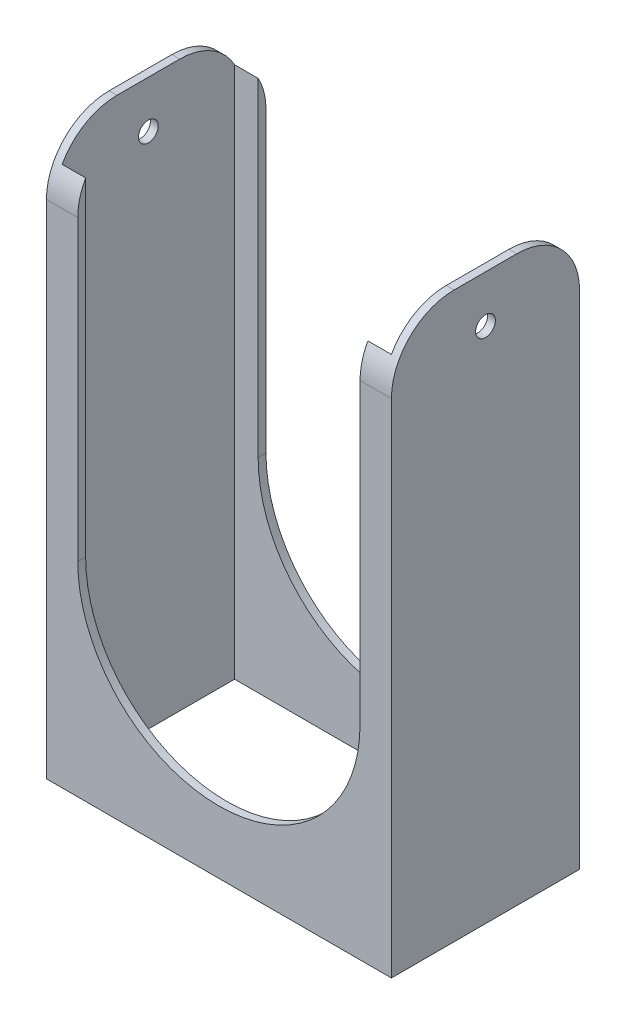
ISO-10303-21;
HEADER;
FILE_DESCRIPTION(('STEP AP214'),'2;1');
FILE_NAME('part.step','',(''),(''),'','','');
FILE_SCHEMA(('AUTOMOTIVE_DESIGN { 1 0 10303 214 1 1 1 1 }'));
ENDSEC;
DATA;
#1=APPLICATION_CONTEXT('core data for automotive mechanical design processes');
#2=APPLICATION_PROTOCOL_DEFINITION('international standard','automotive_design',2000,#1);
#3=PRODUCT_CONTEXT('',#1,'mechanical');
#4=PRODUCT('Part','Part','',(#3));
#5=PRODUCT_RELATED_PRODUCT_CATEGORY('part','',(#4));
#6=PRODUCT_DEFINITION_FORMATION('','',#4);
#7=PRODUCT_DEFINITION_CONTEXT('part definition',#1,'design');
#8=PRODUCT_DEFINITION('design','',#6,#7);
#9=PRODUCT_DEFINITION_SHAPE('','',#8);
#10=(LENGTH_UNIT() NAMED_UNIT(*) SI_UNIT(.MILLI.,.METRE.));
#11=(NAMED_UNIT(*) PLANE_ANGLE_UNIT() SI_UNIT($,.RADIAN.));
#12=(NAMED_UNIT(*) SI_UNIT($,.STERADIAN.) SOLID_ANGLE_UNIT());
#13=UNCERTAINTY_MEASURE_WITH_UNIT(LENGTH_MEASURE(1.E-05),#10,'distance_accuracy_value','');
#14=(GEOMETRIC_REPRESENTATION_CONTEXT(3) GLOBAL_UNCERTAINTY_ASSIGNED_CONTEXT((#13)) GLOBAL_UNIT_ASSIGNED_CONTEXT((#10,
#11,#12)) REPRESENTATION_CONTEXT('',''));
#15=CARTESIAN_POINT('',(0.,0.,0.));
#16=DIRECTION('',(0.,0.,1.));
#17=DIRECTION('',(1.,0.,0.));
#18=AXIS2_PLACEMENT_3D('',#15,#16,#17);
#19=CARTESIAN_POINT('',(-69.85,203.2,12.7));
#20=DIRECTION('',(1.,0.,0.));
#21=DIRECTION('',(0.,0.,-1.));
#22=AXIS2_PLACEMENT_3D('',#19,#20,#21);
#23=CYLINDRICAL_SURFACE('',#22,25.4);
#24=DIRECTION('',(1.,0.,0.));
#25=VECTOR('',#24,1.);
#26=CARTESIAN_POINT('',(-69.85,203.2,38.1));
#27=LINE('',#26,#25);
#28=CARTESIAN_POINT('',(-69.85,203.2,38.1));
#29=VERTEX_POINT('',#28);
#30=CARTESIAN_POINT('',(-57.15,203.2,38.1));
#31=VERTEX_POINT('',#30);
#32=EDGE_CURVE('E362',#29,#31,#27,.T.);
#33=ORIENTED_EDGE('',*,*,#32,.T.);
#34=CARTESIAN_POINT('',(-57.15,203.2,12.7));
#35=DIRECTION('',(-1.,0.,0.));
#36=DIRECTION('',(0.,0.,1.));
#37=AXIS2_PLACEMENT_3D('',#34,#35,#36);
#38=CIRCLE('',#37,25.4);
#39=CARTESIAN_POINT('',(-57.15,215.496722124209,34.925));
#40=VERTEX_POINT('',#39);
#41=EDGE_CURVE('E236',#31,#40,#38,.T.);
#42=ORIENTED_EDGE('',*,*,#41,.T.);
#43=DIRECTION('',(1.,0.,0.));
#44=VECTOR('',#43,1.);
#45=CARTESIAN_POINT('',(-69.85,215.496722124209,34.925));
#46=LINE('',#45,#44);
#47=CARTESIAN_POINT('',(-66.675,215.496722124209,34.925));
#48=VERTEX_POINT('',#47);
#49=EDGE_CURVE('E231',#40,#48,#46,.F.);
#50=ORIENTED_EDGE('',*,*,#49,.T.);
#51=CARTESIAN_POINT('',(-66.675,203.2,12.7));
#52=DIRECTION('',(1.,0.,0.));
#53=DIRECTION('',(0.,0.,-1.));
#54=AXIS2_PLACEMENT_3D('',#51,#52,#53);
#55=CIRCLE('',#54,25.4);
#56=CARTESIAN_POINT('',(-66.675,228.6,12.7));
#57=VERTEX_POINT('',#56);
#58=EDGE_CURVE('E234',#48,#57,#55,.F.);
#59=ORIENTED_EDGE('',*,*,#58,.T.);
#60=DIRECTION('',(1.,0.,0.));
#61=VECTOR('',#60,1.);
#62=CARTESIAN_POINT('',(-69.85,228.6,12.7));
#63=LINE('',#62,#61);
#64=CARTESIAN_POINT('',(-69.85,228.6,12.7));
#65=VERTEX_POINT('',#64);
#66=EDGE_CURVE('E428',#65,#57,#63,.T.);
#67=ORIENTED_EDGE('',*,*,#66,.F.);
#68=CARTESIAN_POINT('',(-69.85,203.2,12.7));
#69=DIRECTION('',(-1.,0.,0.));
#70=DIRECTION('',(0.,0.,1.));
#71=AXIS2_PLACEMENT_3D('',#68,#69,#70);
#72=CIRCLE('',#71,25.4);
#73=EDGE_CURVE('E417',#29,#65,#72,.T.);
#74=ORIENTED_EDGE('',*,*,#73,.F.);
#75=EDGE_LOOP('',(#33,#42,#50,#59,#67,#74));
#76=FACE_BOUND('',#75,.T.);
#77=ADVANCED_FACE('F44',(#76),#23,.T.);
#78=CARTESIAN_POINT('',(-69.85,203.2,-12.7));
#79=DIRECTION('',(1.,0.,0.));
#80=DIRECTION('',(0.,0.,-1.));
#81=AXIS2_PLACEMENT_3D('',#78,#79,#80);
#82=CYLINDRICAL_SURFACE('',#81,25.4);
#83=DIRECTION('',(1.,0.,0.));
#84=VECTOR('',#83,1.);
#85=CARTESIAN_POINT('',(-69.85,215.496722124209,-34.925));
#86=LINE('',#85,#84);
#87=CARTESIAN_POINT('',(-66.675,215.496722124209,-34.925));
#88=VERTEX_POINT('',#87);
#89=CARTESIAN_POINT('',(-57.15,215.496722124209,-34.925));
#90=VERTEX_POINT('',#89);
#91=EDGE_CURVE('E335',#88,#90,#86,.T.);
#92=ORIENTED_EDGE('',*,*,#91,.T.);
#93=CARTESIAN_POINT('',(-57.15,203.2,-12.7));
#94=DIRECTION('',(-1.,0.,0.));
#95=DIRECTION('',(0.,0.,1.));
#96=AXIS2_PLACEMENT_3D('',#93,#94,#95);
#97=CIRCLE('',#96,25.4);
#98=CARTESIAN_POINT('',(-57.15,203.2,-38.1));
#99=VERTEX_POINT('',#98);
#100=EDGE_CURVE('E55',#90,#99,#97,.T.);
#101=ORIENTED_EDGE('',*,*,#100,.T.);
#102=DIRECTION('',(1.,0.,0.));
#103=VECTOR('',#102,1.);
#104=CARTESIAN_POINT('',(-69.85,203.2,-38.1));
#105=LINE('',#104,#103);
#106=CARTESIAN_POINT('',(-69.85,203.2,-38.1));
#107=VERTEX_POINT('',#106);
#108=EDGE_CURVE('E332',#107,#99,#105,.T.);
#109=ORIENTED_EDGE('',*,*,#108,.F.);
#110=CARTESIAN_POINT('',(-69.85,203.2,-12.7));
#111=DIRECTION('',(-1.,0.,0.));
#112=DIRECTION('',(0.,0.,1.));
#113=AXIS2_PLACEMENT_3D('',#110,#111,#112);
#114=CIRCLE('',#113,25.4);
#115=CARTESIAN_POINT('',(-69.85,228.6,-12.7));
#116=VERTEX_POINT('',#115);
#117=EDGE_CURVE('E352',#116,#107,#114,.T.);
#118=ORIENTED_EDGE('',*,*,#117,.F.);
#119=DIRECTION('',(1.,0.,0.));
#120=VECTOR('',#119,1.);
#121=CARTESIAN_POINT('',(-69.85,228.6,-12.7));
#122=LINE('',#121,#120);
#123=CARTESIAN_POINT('',(-66.675,228.6,-12.7));
#124=VERTEX_POINT('',#123);
#125=EDGE_CURVE('E350',#116,#124,#122,.T.);
#126=ORIENTED_EDGE('',*,*,#125,.T.);
#127=CARTESIAN_POINT('',(-66.675,203.2,-12.7));
#128=DIRECTION('',(1.,0.,0.));
#129=DIRECTION('',(0.,0.,-1.));
#130=AXIS2_PLACEMENT_3D('',#127,#128,#129);
#131=CIRCLE('',#130,25.4);
#132=EDGE_CURVE('E255',#124,#88,#131,.F.);
#133=ORIENTED_EDGE('',*,*,#132,.T.);
#134=EDGE_LOOP('',(#92,#101,#109,#118,#126,#133));
#135=FACE_BOUND('',#134,.T.);
#136=ADVANCED_FACE('F331',(#135),#82,.T.);
#137=CARTESIAN_POINT('',(0.,228.6,0.));
#138=DIRECTION('',(0.,-1.,0.));
#139=DIRECTION('',(0.,0.,-1.));
#140=AXIS2_PLACEMENT_3D('',#137,#138,#139);
#141=PLANE('',#140);
#142=DIRECTION('',(0.,0.,-1.));
#143=VECTOR('',#142,1.);
#144=CARTESIAN_POINT('',(69.85,228.6,38.1));
#145=LINE('',#144,#143);
#146=CARTESIAN_POINT('',(69.85,228.6,12.7));
#147=VERTEX_POINT('',#146);
#148=CARTESIAN_POINT('',(69.85,228.6,-12.7));
#149=VERTEX_POINT('',#148);
#150=EDGE_CURVE('E281',#147,#149,#145,.T.);
#151=ORIENTED_EDGE('',*,*,#150,.T.);
#152=CARTESIAN_POINT('',(66.675,228.6,-12.7));
#153=VERTEX_POINT('',#152);
#154=EDGE_CURVE('E345',#153,#149,#122,.T.);
#155=ORIENTED_EDGE('',*,*,#154,.F.);
#156=DIRECTION('',(0.,0.,-1.));
#157=VECTOR('',#156,1.);
#158=CARTESIAN_POINT('',(66.675,228.6,34.925));
#159=LINE('',#158,#157);
#160=CARTESIAN_POINT('',(66.675,228.6,12.7));
#161=VERTEX_POINT('',#160);
#162=EDGE_CURVE('E269',#161,#153,#159,.T.);
#163=ORIENTED_EDGE('',*,*,#162,.F.);
#164=EDGE_CURVE('E421',#161,#147,#63,.T.);
#165=ORIENTED_EDGE('',*,*,#164,.T.);
#166=EDGE_LOOP('',(#151,#155,#163,#165));
#167=FACE_BOUND('',#166,.T.);
#168=ADVANCED_FACE('F474',(#167),#141,.F.);
#169=DIRECTION('',(0.,0.,1.));
#170=VECTOR('',#169,1.);
#171=CARTESIAN_POINT('',(-66.675,228.6,34.925));
#172=LINE('',#171,#170);
#173=EDGE_CURVE('E253',#124,#57,#172,.T.);
#174=ORIENTED_EDGE('',*,*,#173,.F.);
#175=ORIENTED_EDGE('',*,*,#125,.F.);
#176=DIRECTION('',(0.,0.,1.));
#177=VECTOR('',#176,1.);
#178=CARTESIAN_POINT('',(-69.85,228.6,38.1));
#179=LINE('',#178,#177);
#180=EDGE_CURVE('E285',#116,#65,#179,.T.);
#181=ORIENTED_EDGE('',*,*,#180,.T.);
#182=ORIENTED_EDGE('',*,*,#66,.T.);
#183=EDGE_LOOP('',(#174,#175,#181,#182));
#184=FACE_BOUND('',#183,.T.);
#185=ADVANCED_FACE('F458',(#184),#141,.F.);
#186=CARTESIAN_POINT('',(-69.85,228.6,-38.1));
#187=DIRECTION('',(0.,0.,1.));
#188=DIRECTION('',(1.,0.,0.));
#189=AXIS2_PLACEMENT_3D('',#186,#187,#188);
#190=PLANE('',#189);
#191=ORIENTED_EDGE('',*,*,#108,.T.);
#192=DIRECTION('',(0.,-1.,0.));
#193=VECTOR('',#192,1.);
#194=CARTESIAN_POINT('',(-57.15,82.55,-38.1));
#195=LINE('',#194,#193);
#196=CARTESIAN_POINT('',(-57.15,82.55,-38.1));
#197=VERTEX_POINT('',#196);
#198=EDGE_CURVE('E343',#99,#197,#195,.T.);
#199=ORIENTED_EDGE('',*,*,#198,.T.);
#200=CARTESIAN_POINT('',(0.,82.55,-38.1));
#201=DIRECTION('',(0.,0.,1.));
#202=DIRECTION('',(1.,0.,0.));
#203=AXIS2_PLACEMENT_3D('',#200,#201,#202);
#204=CIRCLE('',#203,57.15);
#205=CARTESIAN_POINT('',(57.15,82.55,-38.1));
#206=VERTEX_POINT('',#205);
#207=EDGE_CURVE('E509',#197,#206,#204,.T.);
#208=ORIENTED_EDGE('',*,*,#207,.T.);
#209=DIRECTION('',(0.,1.,0.));
#210=VECTOR('',#209,1.);
#211=CARTESIAN_POINT('',(57.15,228.6,-38.1));
#212=LINE('',#211,#210);
#213=CARTESIAN_POINT('',(57.15,203.2,-38.1));
#214=VERTEX_POINT('',#213);
#215=EDGE_CURVE('E505',#206,#214,#212,.T.);
#216=ORIENTED_EDGE('',*,*,#215,.T.);
#217=CARTESIAN_POINT('',(69.85,203.2,-38.1));
#218=VERTEX_POINT('',#217);
#219=EDGE_CURVE('E346',#214,#218,#105,.T.);
#220=ORIENTED_EDGE('',*,*,#219,.T.);
#221=DIRECTION('',(0.,-1.,0.));
#222=VECTOR('',#221,1.);
#223=CARTESIAN_POINT('',(69.85,228.6,-38.1));
#224=LINE('',#223,#222);
#225=CARTESIAN_POINT('',(69.85,0.,-38.1));
#226=VERTEX_POINT('',#225);
#227=EDGE_CURVE('E256',#218,#226,#224,.T.);
#228=ORIENTED_EDGE('',*,*,#227,.T.);
#229=DIRECTION('',(-1.,0.,0.));
#230=VECTOR('',#229,1.);
#231=CARTESIAN_POINT('',(-69.85,0.,-38.1));
#232=LINE('',#231,#230);
#233=CARTESIAN_POINT('',(-69.85,0.,-38.1));
#234=VERTEX_POINT('',#233);
#235=EDGE_CURVE('E294',#226,#234,#232,.T.);
#236=ORIENTED_EDGE('',*,*,#235,.T.);
#237=DIRECTION('',(0.,-1.,0.));
#238=VECTOR('',#237,1.);
#239=CARTESIAN_POINT('',(-69.85,228.6,-38.1));
#240=LINE('',#239,#238);
#241=EDGE_CURVE('E310',#107,#234,#240,.T.);
#242=ORIENTED_EDGE('',*,*,#241,.F.);
#243=EDGE_LOOP('',(#191,#199,#208,#216,#220,#228,#236,#242));
#244=FACE_BOUND('',#243,.T.);
#245=ADVANCED_FACE('F341',(#244),#190,.F.);
#246=CARTESIAN_POINT('',(0.,0.,0.));
#247=DIRECTION('',(0.,-1.,0.));
#248=DIRECTION('',(0.,0.,-1.));
#249=AXIS2_PLACEMENT_3D('',#246,#247,#248);
#250=PLANE('',#249);
#251=DIRECTION('',(0.,0.,-1.));
#252=VECTOR('',#251,1.);
#253=CARTESIAN_POINT('',(69.85,0.,38.1));
#254=LINE('',#253,#252);
#255=CARTESIAN_POINT('',(69.85,0.,38.1));
#256=VERTEX_POINT('',#255);
#257=EDGE_CURVE('E280',#256,#226,#254,.T.);
#258=ORIENTED_EDGE('',*,*,#257,.F.);
#259=DIRECTION('',(1.,0.,0.));
#260=VECTOR('',#259,1.);
#261=CARTESIAN_POINT('',(-69.85,0.,38.1));
#262=LINE('',#261,#260);
#263=CARTESIAN_POINT('',(-69.85,0.,38.1));
#264=VERTEX_POINT('',#263);
#265=EDGE_CURVE('E286',#264,#256,#262,.T.);
#266=ORIENTED_EDGE('',*,*,#265,.F.);
#267=DIRECTION('',(0.,0.,1.));
#268=VECTOR('',#267,1.);
#269=CARTESIAN_POINT('',(-69.85,0.,38.1));
#270=LINE('',#269,#268);
#271=EDGE_CURVE('E298',#234,#264,#270,.T.);
#272=ORIENTED_EDGE('',*,*,#271,.F.);
#273=ORIENTED_EDGE('',*,*,#235,.F.);
#274=EDGE_LOOP('',(#258,#266,#272,#273));
#275=FACE_BOUND('',#274,.T.);
#276=DIRECTION('',(0.,0.,1.));
#277=VECTOR('',#276,1.);
#278=CARTESIAN_POINT('',(-66.675,0.,34.925));
#279=LINE('',#278,#277);
#280=CARTESIAN_POINT('',(-66.675,0.,-34.925));
#281=VERTEX_POINT('',#280);
#282=CARTESIAN_POINT('',(-66.675,0.,34.925));
#283=VERTEX_POINT('',#282);
#284=EDGE_CURVE('E272',#281,#283,#279,.T.);
#285=ORIENTED_EDGE('',*,*,#284,.T.);
#286=DIRECTION('',(1.,0.,0.));
#287=VECTOR('',#286,1.);
#288=CARTESIAN_POINT('',(-66.675,0.,34.925));
#289=LINE('',#288,#287);
#290=CARTESIAN_POINT('',(66.675,0.,34.925));
#291=VERTEX_POINT('',#290);
#292=EDGE_CURVE('E260',#283,#291,#289,.T.);
#293=ORIENTED_EDGE('',*,*,#292,.T.);
#294=DIRECTION('',(0.,0.,-1.));
#295=VECTOR('',#294,1.);
#296=CARTESIAN_POINT('',(66.675,0.,34.925));
#297=LINE('',#296,#295);
#298=CARTESIAN_POINT('',(66.675,0.,-34.925));
#299=VERTEX_POINT('',#298);
#300=EDGE_CURVE('E382',#291,#299,#297,.T.);
#301=ORIENTED_EDGE('',*,*,#300,.T.);
#302=DIRECTION('',(-1.,0.,0.));
#303=VECTOR('',#302,1.);
#304=CARTESIAN_POINT('',(-66.675,0.,-34.925));
#305=LINE('',#304,#303);
#306=EDGE_CURVE('E385',#299,#281,#305,.T.);
#307=ORIENTED_EDGE('',*,*,#306,.T.);
#308=EDGE_LOOP('',(#285,#293,#301,#307));
#309=FACE_BOUND('',#308,.T.);
#310=ADVANCED_FACE('F391',(#275,#309),#250,.T.);
#311=CARTESIAN_POINT('',(69.85,228.6,38.1));
#312=DIRECTION('',(-1.,0.,0.));
#313=DIRECTION('',(0.,0.,1.));
#314=AXIS2_PLACEMENT_3D('',#311,#312,#313);
#315=PLANE('',#314);
#316=CARTESIAN_POINT('',(69.85,209.55,0.));
#317=DIRECTION('',(1.,0.,0.));
#318=DIRECTION('',(0.,0.,-1.));
#319=AXIS2_PLACEMENT_3D('',#316,#317,#318);
#320=CIRCLE('',#319,4.);
#321=CARTESIAN_POINT('',(69.85,209.55,-4.));
#322=VERTEX_POINT('',#321);
#323=EDGE_CURVE('E358',#322,#322,#320,.T.);
#324=ORIENTED_EDGE('',*,*,#323,.F.);
#325=EDGE_LOOP('',(#324));
#326=FACE_BOUND('',#325,.T.);
#327=ORIENTED_EDGE('',*,*,#227,.F.);
#328=CARTESIAN_POINT('',(69.85,203.2,-12.7));
#329=DIRECTION('',(-1.,0.,0.));
#330=DIRECTION('',(0.,0.,1.));
#331=AXIS2_PLACEMENT_3D('',#328,#329,#330);
#332=CIRCLE('',#331,25.4);
#333=EDGE_CURVE('E432',#149,#218,#332,.T.);
#334=ORIENTED_EDGE('',*,*,#333,.F.);
#335=ORIENTED_EDGE('',*,*,#150,.F.);
#336=CARTESIAN_POINT('',(69.85,203.2,12.7));
#337=DIRECTION('',(-1.,0.,0.));
#338=DIRECTION('',(0.,0.,1.));
#339=AXIS2_PLACEMENT_3D('',#336,#337,#338);
#340=CIRCLE('',#339,25.4);
#341=CARTESIAN_POINT('',(69.85,203.2,38.1));
#342=VERTEX_POINT('',#341);
#343=EDGE_CURVE('E422',#342,#147,#340,.T.);
#344=ORIENTED_EDGE('',*,*,#343,.F.);
#345=DIRECTION('',(0.,-1.,0.));
#346=VECTOR('',#345,1.);
#347=CARTESIAN_POINT('',(69.85,228.6,38.1));
#348=LINE('',#347,#346);
#349=EDGE_CURVE('E290',#342,#256,#348,.T.);
#350=ORIENTED_EDGE('',*,*,#349,.T.);
#351=ORIENTED_EDGE('',*,*,#257,.T.);
#352=EDGE_LOOP('',(#327,#334,#335,#344,#350,#351));
#353=FACE_BOUND('',#352,.T.);
#354=ADVANCED_FACE('F46',(#326,#353),#315,.F.);
#355=CARTESIAN_POINT('',(-69.85,228.6,38.1));
#356=DIRECTION('',(1.,0.,0.));
#357=DIRECTION('',(0.,0.,-1.));
#358=AXIS2_PLACEMENT_3D('',#355,#356,#357);
#359=PLANE('',#358);
#360=CARTESIAN_POINT('',(-69.85,209.55,0.));
#361=DIRECTION('',(1.,0.,0.));
#362=DIRECTION('',(0.,0.,-1.));
#363=AXIS2_PLACEMENT_3D('',#360,#361,#362);
#364=CIRCLE('',#363,4.);
#365=CARTESIAN_POINT('',(-69.85,209.55,-4.));
#366=VERTEX_POINT('',#365);
#367=EDGE_CURVE('E318',#366,#366,#364,.T.);
#368=ORIENTED_EDGE('',*,*,#367,.T.);
#369=EDGE_LOOP('',(#368));
#370=FACE_BOUND('',#369,.T.);
#371=ORIENTED_EDGE('',*,*,#180,.F.);
#372=ORIENTED_EDGE('',*,*,#117,.T.);
#373=ORIENTED_EDGE('',*,*,#241,.T.);
#374=ORIENTED_EDGE('',*,*,#271,.T.);
#375=DIRECTION('',(0.,-1.,0.));
#376=VECTOR('',#375,1.);
#377=CARTESIAN_POINT('',(-69.85,228.6,38.1));
#378=LINE('',#377,#376);
#379=EDGE_CURVE('E307',#29,#264,#378,.T.);
#380=ORIENTED_EDGE('',*,*,#379,.F.);
#381=ORIENTED_EDGE('',*,*,#73,.T.);
#382=EDGE_LOOP('',(#371,#372,#373,#374,#380,#381));
#383=FACE_BOUND('',#382,.T.);
#384=ADVANCED_FACE('F460',(#370,#383),#359,.F.);
#385=CARTESIAN_POINT('',(-69.85,228.6,38.1));
#386=DIRECTION('',(0.,0.,-1.));
#387=DIRECTION('',(-1.,0.,0.));
#388=AXIS2_PLACEMENT_3D('',#385,#386,#387);
#389=PLANE('',#388);
#390=CARTESIAN_POINT('',(0.,82.55,38.1));
#391=DIRECTION('',(0.,0.,1.));
#392=DIRECTION('',(1.,0.,0.));
#393=AXIS2_PLACEMENT_3D('',#390,#391,#392);
#394=CIRCLE('',#393,57.15);
#395=CARTESIAN_POINT('',(-57.15,82.55,38.1));
#396=VERTEX_POINT('',#395);
#397=CARTESIAN_POINT('',(57.15,82.55,38.1));
#398=VERTEX_POINT('',#397);
#399=EDGE_CURVE('E48',#396,#398,#394,.T.);
#400=ORIENTED_EDGE('',*,*,#399,.F.);
#401=DIRECTION('',(0.,1.,0.));
#402=VECTOR('',#401,1.);
#403=CARTESIAN_POINT('',(-57.15,228.6,38.1));
#404=LINE('',#403,#402);
#405=EDGE_CURVE('E82',#396,#31,#404,.T.);
#406=ORIENTED_EDGE('',*,*,#405,.T.);
#407=ORIENTED_EDGE('',*,*,#32,.F.);
#408=ORIENTED_EDGE('',*,*,#379,.T.);
#409=ORIENTED_EDGE('',*,*,#265,.T.);
#410=ORIENTED_EDGE('',*,*,#349,.F.);
#411=CARTESIAN_POINT('',(57.15,203.2,38.1));
#412=VERTEX_POINT('',#411);
#413=EDGE_CURVE('E427',#412,#342,#27,.T.);
#414=ORIENTED_EDGE('',*,*,#413,.F.);
#415=DIRECTION('',(0.,-1.,0.));
#416=VECTOR('',#415,1.);
#417=CARTESIAN_POINT('',(57.15,228.6,38.1));
#418=LINE('',#417,#416);
#419=EDGE_CURVE('E66',#412,#398,#418,.T.);
#420=ORIENTED_EDGE('',*,*,#419,.T.);
#421=EDGE_LOOP('',(#400,#406,#407,#408,#409,#410,#414,#420));
#422=FACE_BOUND('',#421,.T.);
#423=ADVANCED_FACE('F447',(#422),#389,.F.);
#424=CARTESIAN_POINT('',(-66.675,228.6,34.925));
#425=DIRECTION('',(0.,0.,-1.));
#426=DIRECTION('',(-1.,0.,0.));
#427=AXIS2_PLACEMENT_3D('',#424,#425,#426);
#428=PLANE('',#427);
#429=DIRECTION('',(0.,1.,0.));
#430=VECTOR('',#429,1.);
#431=CARTESIAN_POINT('',(-57.15,228.6,34.925));
#432=LINE('',#431,#430);
#433=CARTESIAN_POINT('',(-57.15,82.55,34.925));
#434=VERTEX_POINT('',#433);
#435=EDGE_CURVE('E404',#434,#40,#432,.T.);
#436=ORIENTED_EDGE('',*,*,#435,.F.);
#437=CARTESIAN_POINT('',(0.,82.55,34.925));
#438=DIRECTION('',(0.,0.,-1.));
#439=DIRECTION('',(-1.,0.,0.));
#440=AXIS2_PLACEMENT_3D('',#437,#438,#439);
#441=CIRCLE('',#440,57.15);
#442=CARTESIAN_POINT('',(57.15,82.55,34.925));
#443=VERTEX_POINT('',#442);
#444=EDGE_CURVE('E414',#443,#434,#441,.T.);
#445=ORIENTED_EDGE('',*,*,#444,.F.);
#446=DIRECTION('',(0.,-1.,0.));
#447=VECTOR('',#446,1.);
#448=CARTESIAN_POINT('',(57.1499999999999,228.6,34.925));
#449=LINE('',#448,#447);
#450=CARTESIAN_POINT('',(57.15,215.496722124209,34.925));
#451=VERTEX_POINT('',#450);
#452=EDGE_CURVE('E406',#451,#443,#449,.T.);
#453=ORIENTED_EDGE('',*,*,#452,.F.);
#454=CARTESIAN_POINT('',(66.675,215.496722124209,34.925));
#455=VERTEX_POINT('',#454);
#456=EDGE_CURVE('E241',#455,#451,#46,.F.);
#457=ORIENTED_EDGE('',*,*,#456,.F.);
#458=DIRECTION('',(0.,-1.,0.));
#459=VECTOR('',#458,1.);
#460=CARTESIAN_POINT('',(66.675,228.6,34.925));
#461=LINE('',#460,#459);
#462=EDGE_CURVE('E277',#455,#291,#461,.T.);
#463=ORIENTED_EDGE('',*,*,#462,.T.);
#464=ORIENTED_EDGE('',*,*,#292,.F.);
#465=DIRECTION('',(0.,-1.,0.));
#466=VECTOR('',#465,1.);
#467=CARTESIAN_POINT('',(-66.675,228.6,34.925));
#468=LINE('',#467,#466);
#469=EDGE_CURVE('E250',#48,#283,#468,.T.);
#470=ORIENTED_EDGE('',*,*,#469,.F.);
#471=ORIENTED_EDGE('',*,*,#49,.F.);
#472=EDGE_LOOP('',(#436,#445,#453,#457,#463,#464,#470,#471));
#473=FACE_BOUND('',#472,.T.);
#474=ADVANCED_FACE('F258',(#473),#428,.T.);
#475=CARTESIAN_POINT('',(66.675,228.6,34.925));
#476=DIRECTION('',(-1.,0.,0.));
#477=DIRECTION('',(0.,0.,1.));
#478=AXIS2_PLACEMENT_3D('',#475,#476,#477);
#479=PLANE('',#478);
#480=CARTESIAN_POINT('',(66.675,203.2,-12.7));
#481=DIRECTION('',(-1.,0.,0.));
#482=DIRECTION('',(0.,0.,1.));
#483=AXIS2_PLACEMENT_3D('',#480,#481,#482);
#484=CIRCLE('',#483,25.4);
#485=CARTESIAN_POINT('',(66.675,215.496722124209,-34.925));
#486=VERTEX_POINT('',#485);
#487=EDGE_CURVE('E374',#486,#153,#484,.F.);
#488=ORIENTED_EDGE('',*,*,#487,.F.);
#489=DIRECTION('',(0.,-1.,0.));
#490=VECTOR('',#489,1.);
#491=CARTESIAN_POINT('',(66.675,228.6,-34.925));
#492=LINE('',#491,#490);
#493=EDGE_CURVE('E267',#486,#299,#492,.T.);
#494=ORIENTED_EDGE('',*,*,#493,.T.);
#495=ORIENTED_EDGE('',*,*,#300,.F.);
#496=ORIENTED_EDGE('',*,*,#462,.F.);
#497=CARTESIAN_POINT('',(66.675,203.2,12.7));
#498=DIRECTION('',(-1.,0.,0.));
#499=DIRECTION('',(0.,0.,1.));
#500=AXIS2_PLACEMENT_3D('',#497,#498,#499);
#501=CIRCLE('',#500,25.4);
#502=EDGE_CURVE('E368',#161,#455,#501,.F.);
#503=ORIENTED_EDGE('',*,*,#502,.F.);
#504=ORIENTED_EDGE('',*,*,#162,.T.);
#505=EDGE_LOOP('',(#488,#494,#495,#496,#503,#504));
#506=FACE_BOUND('',#505,.T.);
#507=CARTESIAN_POINT('',(66.675,209.55,0.));
#508=DIRECTION('',(-1.,0.,0.));
#509=DIRECTION('',(0.,0.,1.));
#510=AXIS2_PLACEMENT_3D('',#507,#508,#509);
#511=CIRCLE('',#510,4.);
#512=CARTESIAN_POINT('',(66.675,209.55,4.));
#513=VERTEX_POINT('',#512);
#514=EDGE_CURVE('E242',#513,#513,#511,.T.);
#515=ORIENTED_EDGE('',*,*,#514,.F.);
#516=EDGE_LOOP('',(#515));
#517=FACE_BOUND('',#516,.T.);
#518=ADVANCED_FACE('F478',(#506,#517),#479,.T.);
#519=CARTESIAN_POINT('',(-66.675,228.6,-34.925));
#520=DIRECTION('',(0.,0.,1.));
#521=DIRECTION('',(1.,0.,0.));
#522=AXIS2_PLACEMENT_3D('',#519,#520,#521);
#523=PLANE('',#522);
#524=DIRECTION('',(0.,-1.,0.));
#525=VECTOR('',#524,1.);
#526=CARTESIAN_POINT('',(-57.15,228.6,-34.925));
#527=LINE('',#526,#525);
#528=CARTESIAN_POINT('',(-57.15,82.55,-34.925));
#529=VERTEX_POINT('',#528);
#530=EDGE_CURVE('E397',#90,#529,#527,.T.);
#531=ORIENTED_EDGE('',*,*,#530,.F.);
#532=ORIENTED_EDGE('',*,*,#91,.F.);
#533=DIRECTION('',(0.,-1.,0.));
#534=VECTOR('',#533,1.);
#535=CARTESIAN_POINT('',(-66.675,228.6,-34.925));
#536=LINE('',#535,#534);
#537=EDGE_CURVE('E263',#88,#281,#536,.T.);
#538=ORIENTED_EDGE('',*,*,#537,.T.);
#539=ORIENTED_EDGE('',*,*,#306,.F.);
#540=ORIENTED_EDGE('',*,*,#493,.F.);
#541=CARTESIAN_POINT('',(57.15,215.496722124209,-34.925));
#542=VERTEX_POINT('',#541);
#543=EDGE_CURVE('E371',#542,#486,#86,.T.);
#544=ORIENTED_EDGE('',*,*,#543,.F.);
#545=DIRECTION('',(0.,1.,0.));
#546=VECTOR('',#545,1.);
#547=CARTESIAN_POINT('',(57.1499999999999,228.6,-34.925));
#548=LINE('',#547,#546);
#549=CARTESIAN_POINT('',(57.15,82.55,-34.925));
#550=VERTEX_POINT('',#549);
#551=EDGE_CURVE('E487',#550,#542,#548,.T.);
#552=ORIENTED_EDGE('',*,*,#551,.F.);
#553=CARTESIAN_POINT('',(0.,82.55,-34.925));
#554=DIRECTION('',(0.,0.,1.));
#555=DIRECTION('',(1.,0.,0.));
#556=AXIS2_PLACEMENT_3D('',#553,#554,#555);
#557=CIRCLE('',#556,57.15);
#558=EDGE_CURVE('E12',#529,#550,#557,.T.);
#559=ORIENTED_EDGE('',*,*,#558,.F.);
#560=EDGE_LOOP('',(#531,#532,#538,#539,#540,#544,#552,#559));
#561=FACE_BOUND('',#560,.T.);
#562=ADVANCED_FACE('F394',(#561),#523,.T.);
#563=CARTESIAN_POINT('',(-66.675,228.6,34.925));
#564=DIRECTION('',(1.,0.,0.));
#565=DIRECTION('',(0.,0.,-1.));
#566=AXIS2_PLACEMENT_3D('',#563,#564,#565);
#567=PLANE('',#566);
#568=ORIENTED_EDGE('',*,*,#132,.F.);
#569=ORIENTED_EDGE('',*,*,#173,.T.);
#570=ORIENTED_EDGE('',*,*,#58,.F.);
#571=ORIENTED_EDGE('',*,*,#469,.T.);
#572=ORIENTED_EDGE('',*,*,#284,.F.);
#573=ORIENTED_EDGE('',*,*,#537,.F.);
#574=EDGE_LOOP('',(#568,#569,#570,#571,#572,#573));
#575=FACE_BOUND('',#574,.T.);
#576=CARTESIAN_POINT('',(-66.675,209.55,0.));
#577=DIRECTION('',(1.,0.,0.));
#578=DIRECTION('',(0.,0.,-1.));
#579=AXIS2_PLACEMENT_3D('',#576,#577,#578);
#580=CIRCLE('',#579,4.);
#581=CARTESIAN_POINT('',(-66.675,209.55,-4.));
#582=VERTEX_POINT('',#581);
#583=EDGE_CURVE('E315',#582,#582,#580,.T.);
#584=ORIENTED_EDGE('',*,*,#583,.F.);
#585=EDGE_LOOP('',(#584));
#586=FACE_BOUND('',#585,.T.);
#587=ADVANCED_FACE('F247',(#575,#586),#567,.T.);
#588=CARTESIAN_POINT('',(-69.85,209.55,0.));
#589=DIRECTION('',(1.,0.,0.));
#590=DIRECTION('',(0.,0.,-1.));
#591=AXIS2_PLACEMENT_3D('',#588,#589,#590);
#592=CYLINDRICAL_SURFACE('',#591,4.);
#593=ORIENTED_EDGE('',*,*,#583,.T.);
#594=EDGE_LOOP('',(#593));
#595=FACE_BOUND('',#594,.T.);
#596=ORIENTED_EDGE('',*,*,#367,.F.);
#597=EDGE_LOOP('',(#596));
#598=FACE_BOUND('',#597,.T.);
#599=ADVANCED_FACE('F535',(#595,#598),#592,.F.);
#600=ORIENTED_EDGE('',*,*,#456,.T.);
#601=CARTESIAN_POINT('',(57.15,203.2,12.7));
#602=DIRECTION('',(1.,0.,0.));
#603=DIRECTION('',(0.,1.,0.));
#604=AXIS2_PLACEMENT_3D('',#601,#602,#603);
#605=CIRCLE('',#604,25.4);
#606=EDGE_CURVE('E485',#451,#412,#605,.T.);
#607=ORIENTED_EDGE('',*,*,#606,.T.);
#608=ORIENTED_EDGE('',*,*,#413,.T.);
#609=ORIENTED_EDGE('',*,*,#343,.T.);
#610=ORIENTED_EDGE('',*,*,#164,.F.);
#611=ORIENTED_EDGE('',*,*,#502,.T.);
#612=EDGE_LOOP('',(#600,#607,#608,#609,#610,#611));
#613=FACE_BOUND('',#612,.T.);
#614=ADVANCED_FACE('F470',(#613),#23,.T.);
#615=ORIENTED_EDGE('',*,*,#219,.F.);
#616=CARTESIAN_POINT('',(57.15,203.2,-12.7));
#617=DIRECTION('',(1.,0.,0.));
#618=DIRECTION('',(0.,1.,0.));
#619=AXIS2_PLACEMENT_3D('',#616,#617,#618);
#620=CIRCLE('',#619,25.4);
#621=EDGE_CURVE('E322',#214,#542,#620,.T.);
#622=ORIENTED_EDGE('',*,*,#621,.T.);
#623=ORIENTED_EDGE('',*,*,#543,.T.);
#624=ORIENTED_EDGE('',*,*,#487,.T.);
#625=ORIENTED_EDGE('',*,*,#154,.T.);
#626=ORIENTED_EDGE('',*,*,#333,.T.);
#627=EDGE_LOOP('',(#615,#622,#623,#624,#625,#626));
#628=FACE_BOUND('',#627,.T.);
#629=ADVANCED_FACE('F533',(#628),#82,.T.);
#630=ORIENTED_EDGE('',*,*,#514,.T.);
#631=EDGE_LOOP('',(#630));
#632=FACE_BOUND('',#631,.T.);
#633=ORIENTED_EDGE('',*,*,#323,.T.);
#634=EDGE_LOOP('',(#633));
#635=FACE_BOUND('',#634,.T.);
#636=ADVANCED_FACE('F522',(#632,#635),#592,.F.);
#637=CARTESIAN_POINT('',(57.15,228.6,-38.1));
#638=DIRECTION('',(1.,0.,0.));
#639=DIRECTION('',(0.,1.,0.));
#640=AXIS2_PLACEMENT_3D('',#637,#638,#639);
#641=PLANE('',#640);
#642=ORIENTED_EDGE('',*,*,#551,.T.);
#643=ORIENTED_EDGE('',*,*,#621,.F.);
#644=ORIENTED_EDGE('',*,*,#215,.F.);
#645=DIRECTION('',(0.,0.,1.));
#646=VECTOR('',#645,1.);
#647=CARTESIAN_POINT('',(57.15,82.55,-38.1));
#648=LINE('',#647,#646);
#649=EDGE_CURVE('E101',#206,#550,#648,.T.);
#650=ORIENTED_EDGE('',*,*,#649,.T.);
#651=EDGE_LOOP('',(#642,#643,#644,#650));
#652=FACE_BOUND('',#651,.T.);
#653=ADVANCED_FACE('F514',(#652),#641,.F.);
#654=CARTESIAN_POINT('',(-57.15,82.55,-38.1));
#655=DIRECTION('',(-1.,0.,0.));
#656=DIRECTION('',(0.,0.,1.));
#657=AXIS2_PLACEMENT_3D('',#654,#655,#656);
#658=PLANE('',#657);
#659=ORIENTED_EDGE('',*,*,#530,.T.);
#660=DIRECTION('',(0.,0.,1.));
#661=VECTOR('',#660,1.);
#662=CARTESIAN_POINT('',(-57.15,82.55,-38.1));
#663=LINE('',#662,#661);
#664=EDGE_CURVE('E492',#197,#529,#663,.T.);
#665=ORIENTED_EDGE('',*,*,#664,.F.);
#666=ORIENTED_EDGE('',*,*,#198,.F.);
#667=ORIENTED_EDGE('',*,*,#100,.F.);
#668=EDGE_LOOP('',(#659,#665,#666,#667));
#669=FACE_BOUND('',#668,.T.);
#670=ADVANCED_FACE('F512',(#669),#658,.F.);
#671=CARTESIAN_POINT('',(0.,82.55,-38.1));
#672=DIRECTION('',(0.,0.,1.));
#673=DIRECTION('',(1.,0.,0.));
#674=AXIS2_PLACEMENT_3D('',#671,#672,#673);
#675=CYLINDRICAL_SURFACE('',#674,57.15);
#676=ORIENTED_EDGE('',*,*,#558,.T.);
#677=ORIENTED_EDGE('',*,*,#649,.F.);
#678=ORIENTED_EDGE('',*,*,#207,.F.);
#679=ORIENTED_EDGE('',*,*,#664,.T.);
#680=EDGE_LOOP('',(#676,#677,#678,#679));
#681=FACE_BOUND('',#680,.T.);
#682=ADVANCED_FACE('F511',(#681),#675,.F.);
#683=EDGE_CURVE('E90',#443,#398,#648,.T.);
#684=ORIENTED_EDGE('',*,*,#683,.F.);
#685=ORIENTED_EDGE('',*,*,#444,.T.);
#686=EDGE_CURVE('E444',#434,#396,#663,.T.);
#687=ORIENTED_EDGE('',*,*,#686,.T.);
#688=ORIENTED_EDGE('',*,*,#399,.T.);
#689=EDGE_LOOP('',(#684,#685,#687,#688));
#690=FACE_BOUND('',#689,.T.);
#691=ADVANCED_FACE('F442',(#690),#675,.F.);
#692=ORIENTED_EDGE('',*,*,#686,.F.);
#693=ORIENTED_EDGE('',*,*,#435,.T.);
#694=ORIENTED_EDGE('',*,*,#41,.F.);
#695=ORIENTED_EDGE('',*,*,#405,.F.);
#696=EDGE_LOOP('',(#692,#693,#694,#695));
#697=FACE_BOUND('',#696,.T.);
#698=ADVANCED_FACE('F516',(#697),#658,.F.);
#699=ORIENTED_EDGE('',*,*,#606,.F.);
#700=ORIENTED_EDGE('',*,*,#452,.T.);
#701=ORIENTED_EDGE('',*,*,#683,.T.);
#702=ORIENTED_EDGE('',*,*,#419,.F.);
#703=EDGE_LOOP('',(#699,#700,#701,#702));
#704=FACE_BOUND('',#703,.T.);
#705=ADVANCED_FACE('F525',(#704),#641,.F.);
#706=CLOSED_SHELL('',(#77,#136,#168,#185,#245,#310,#354,#384,#423,#474,#518,#562,#587,#599,#614,
#629,#636,#653,#670,#682,#691,#698,#705));
#707=MANIFOLD_SOLID_BREP('B2',#706);
#708=ADVANCED_BREP_SHAPE_REPRESENTATION('',(#18,#707),#14);
#709=SHAPE_DEFINITION_REPRESENTATION(#9,#708);
ENDSEC;
END-ISO-10303-21;
